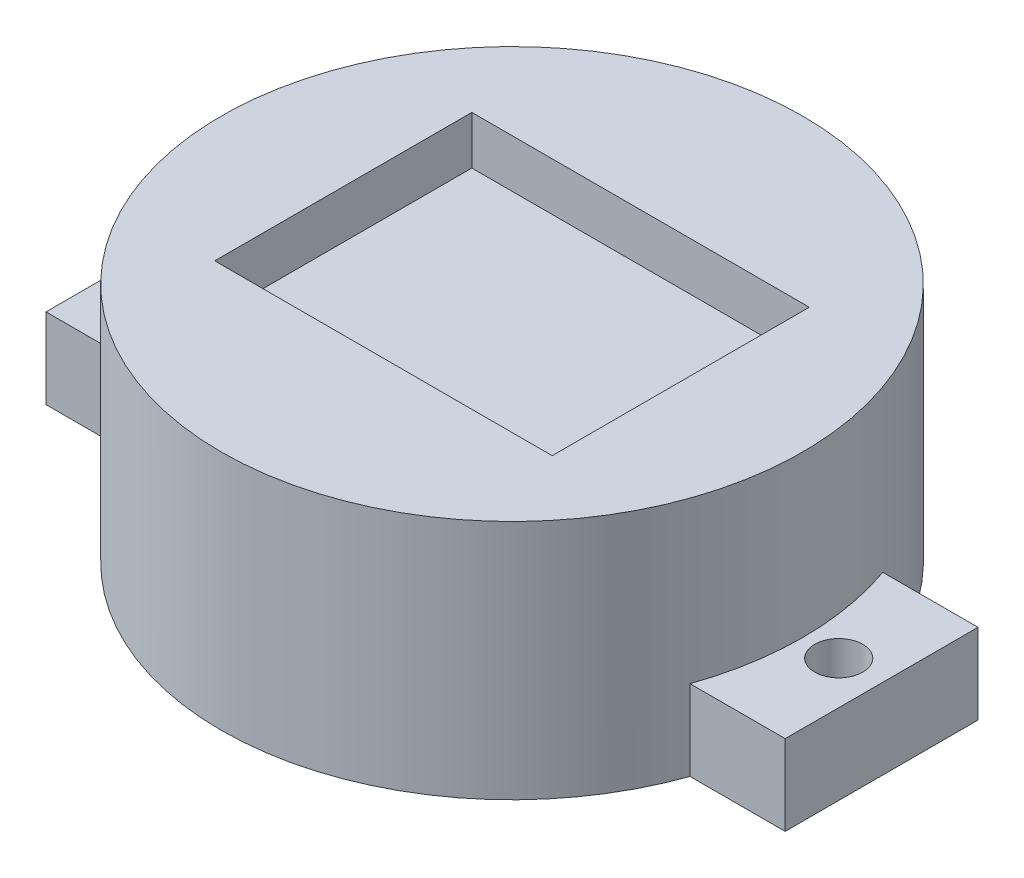
ISO-10303-21;
HEADER;
FILE_DESCRIPTION(('STEP AP214'),'2;1');
FILE_NAME('part.step','',(''),(''),'','','');
FILE_SCHEMA(('AUTOMOTIVE_DESIGN { 1 0 10303 214 1 1 1 1 }'));
ENDSEC;
DATA;
#1=APPLICATION_CONTEXT('core data for automotive mechanical design processes');
#2=APPLICATION_PROTOCOL_DEFINITION('international standard','automotive_design',2000,#1);
#3=PRODUCT_CONTEXT('',#1,'mechanical');
#4=PRODUCT('Part','Part','',(#3));
#5=PRODUCT_RELATED_PRODUCT_CATEGORY('part','',(#4));
#6=PRODUCT_DEFINITION_FORMATION('','',#4);
#7=PRODUCT_DEFINITION_CONTEXT('part definition',#1,'design');
#8=PRODUCT_DEFINITION('design','',#6,#7);
#9=PRODUCT_DEFINITION_SHAPE('','',#8);
#10=(LENGTH_UNIT() NAMED_UNIT(*) SI_UNIT(.MILLI.,.METRE.));
#11=(NAMED_UNIT(*) PLANE_ANGLE_UNIT() SI_UNIT($,.RADIAN.));
#12=(NAMED_UNIT(*) SI_UNIT($,.STERADIAN.) SOLID_ANGLE_UNIT());
#13=UNCERTAINTY_MEASURE_WITH_UNIT(LENGTH_MEASURE(1.E-05),#10,'distance_accuracy_value','');
#14=(GEOMETRIC_REPRESENTATION_CONTEXT(3) GLOBAL_UNCERTAINTY_ASSIGNED_CONTEXT((#13)) GLOBAL_UNIT_ASSIGNED_CONTEXT((#10,
#11,#12)) REPRESENTATION_CONTEXT('',''));
#15=CARTESIAN_POINT('',(0.,0.,0.));
#16=DIRECTION('',(0.,0.,1.));
#17=DIRECTION('',(1.,0.,0.));
#18=AXIS2_PLACEMENT_3D('',#15,#16,#17);
#19=CARTESIAN_POINT('',(-18.1,9.,0.));
#20=DIRECTION('',(0.,1.,0.));
#21=DIRECTION('',(0.,0.,1.));
#22=AXIS2_PLACEMENT_3D('',#19,#20,#21);
#23=PLANE('',#22);
#24=DIRECTION('',(0.,0.,-1.));
#25=VECTOR('',#24,1.);
#26=CARTESIAN_POINT('',(10.5,9.,8.));
#27=LINE('',#26,#25);
#28=CARTESIAN_POINT('',(10.5,9.,8.));
#29=VERTEX_POINT('',#28);
#30=CARTESIAN_POINT('',(10.5,9.,-8.));
#31=VERTEX_POINT('',#30);
#32=EDGE_CURVE('E183',#29,#31,#27,.T.);
#33=ORIENTED_EDGE('',*,*,#32,.F.);
#34=DIRECTION('',(1.,0.,0.));
#35=VECTOR('',#34,1.);
#36=CARTESIAN_POINT('',(-10.5,9.,8.));
#37=LINE('',#36,#35);
#38=CARTESIAN_POINT('',(-10.5,9.,8.));
#39=VERTEX_POINT('',#38);
#40=EDGE_CURVE('E190',#39,#29,#37,.T.);
#41=ORIENTED_EDGE('',*,*,#40,.F.);
#42=DIRECTION('',(0.,0.,1.));
#43=VECTOR('',#42,1.);
#44=CARTESIAN_POINT('',(-10.5,9.,8.));
#45=LINE('',#44,#43);
#46=CARTESIAN_POINT('',(-10.5,9.,-8.));
#47=VERTEX_POINT('',#46);
#48=EDGE_CURVE('E204',#47,#39,#45,.T.);
#49=ORIENTED_EDGE('',*,*,#48,.F.);
#50=DIRECTION('',(-1.,0.,0.));
#51=VECTOR('',#50,1.);
#52=CARTESIAN_POINT('',(-10.5,9.,-8.));
#53=LINE('',#52,#51);
#54=EDGE_CURVE('E201',#31,#47,#53,.T.);
#55=ORIENTED_EDGE('',*,*,#54,.F.);
#56=EDGE_LOOP('',(#33,#41,#49,#55));
#57=FACE_BOUND('',#56,.T.);
#58=CARTESIAN_POINT('',(0.,9.,0.));
#59=DIRECTION('',(0.,1.,0.));
#60=DIRECTION('',(0.,0.,1.));
#61=AXIS2_PLACEMENT_3D('',#58,#59,#60);
#62=CIRCLE('',#61,18.1);
#63=CARTESIAN_POINT('',(0.,9.,18.1));
#64=VERTEX_POINT('',#63);
#65=EDGE_CURVE('E211',#64,#64,#62,.T.);
#66=ORIENTED_EDGE('',*,*,#65,.T.);
#67=EDGE_LOOP('',(#66));
#68=FACE_BOUND('',#67,.T.);
#69=ADVANCED_FACE('F39',(#57,#68),#23,.T.);
#70=CARTESIAN_POINT('',(-13.1,0.,0.));
#71=DIRECTION('',(0.,-1.,0.));
#72=DIRECTION('',(0.,0.,-1.));
#73=AXIS2_PLACEMENT_3D('',#70,#71,#72);
#74=PLANE('',#73);
#75=CARTESIAN_POINT('',(0.,0.,0.));
#76=DIRECTION('',(0.,1.,0.));
#77=DIRECTION('',(0.,0.,1.));
#78=AXIS2_PLACEMENT_3D('',#75,#76,#77);
#79=CIRCLE('',#78,13.1);
#80=CARTESIAN_POINT('',(0.,0.,13.1));
#81=VERTEX_POINT('',#80);
#82=EDGE_CURVE('E226',#81,#81,#79,.T.);
#83=ORIENTED_EDGE('',*,*,#82,.F.);
#84=EDGE_LOOP('',(#83));
#85=FACE_BOUND('',#84,.T.);
#86=ADVANCED_FACE('F271',(#85),#74,.T.);
#87=CARTESIAN_POINT('',(0.,25.3230066385182,0.));
#88=DIRECTION('',(0.,1.,0.));
#89=DIRECTION('',(0.,0.,1.));
#90=AXIS2_PLACEMENT_3D('',#87,#88,#89);
#91=CYLINDRICAL_SURFACE('',#90,13.1);
#92=ORIENTED_EDGE('',*,*,#82,.T.);
#93=EDGE_LOOP('',(#92));
#94=FACE_BOUND('',#93,.T.);
#95=CARTESIAN_POINT('',(0.,-6.,0.));
#96=DIRECTION('',(0.,1.,0.));
#97=DIRECTION('',(0.,0.,1.));
#98=AXIS2_PLACEMENT_3D('',#95,#96,#97);
#99=CIRCLE('',#98,13.1);
#100=CARTESIAN_POINT('',(0.,-6.,13.1));
#101=VERTEX_POINT('',#100);
#102=EDGE_CURVE('E223',#101,#101,#99,.T.);
#103=ORIENTED_EDGE('',*,*,#102,.F.);
#104=EDGE_LOOP('',(#103));
#105=FACE_BOUND('',#104,.T.);
#106=ADVANCED_FACE('F276',(#94,#105),#91,.F.);
#107=CARTESIAN_POINT('',(-18.1,-6.,0.));
#108=DIRECTION('',(0.,-1.,0.));
#109=DIRECTION('',(0.,0.,-1.));
#110=AXIS2_PLACEMENT_3D('',#107,#108,#109);
#111=PLANE('',#110);
#112=DIRECTION('',(-1.,0.,0.));
#113=VECTOR('',#112,1.);
#114=CARTESIAN_POINT('',(15.,-6.,5.99999999999999));
#115=LINE('',#114,#113);
#116=CARTESIAN_POINT('',(23.,-6.,5.99999999999999));
#117=VERTEX_POINT('',#116);
#118=CARTESIAN_POINT('',(17.076592165886,-6.,5.99999999999999));
#119=VERTEX_POINT('',#118);
#120=EDGE_CURVE('E133',#117,#119,#115,.T.);
#121=ORIENTED_EDGE('',*,*,#120,.T.);
#122=CARTESIAN_POINT('',(0.,-6.,0.));
#123=DIRECTION('',(0.,1.,0.));
#124=DIRECTION('',(0.,0.,1.));
#125=AXIS2_PLACEMENT_3D('',#122,#123,#124);
#126=CIRCLE('',#125,18.1);
#127=CARTESIAN_POINT('',(-17.076592165886,-6.,5.99999999999999));
#128=VERTEX_POINT('',#127);
#129=EDGE_CURVE('E221',#128,#119,#126,.T.);
#130=ORIENTED_EDGE('',*,*,#129,.F.);
#131=DIRECTION('',(-1.,0.,0.));
#132=VECTOR('',#131,1.);
#133=CARTESIAN_POINT('',(-15.,-6.,5.99999999999999));
#134=LINE('',#133,#132);
#135=CARTESIAN_POINT('',(-23.,-6.,5.99999999999999));
#136=VERTEX_POINT('',#135);
#137=EDGE_CURVE('E162',#128,#136,#134,.T.);
#138=ORIENTED_EDGE('',*,*,#137,.T.);
#139=DIRECTION('',(0.,0.,-1.));
#140=VECTOR('',#139,1.);
#141=CARTESIAN_POINT('',(-23.,-6.,5.99999999999999));
#142=LINE('',#141,#140);
#143=CARTESIAN_POINT('',(-23.,-6.,-6.00000000000001));
#144=VERTEX_POINT('',#143);
#145=EDGE_CURVE('E176',#136,#144,#142,.T.);
#146=ORIENTED_EDGE('',*,*,#145,.T.);
#147=DIRECTION('',(1.,0.,0.));
#148=VECTOR('',#147,1.);
#149=CARTESIAN_POINT('',(-15.,-6.,-6.00000000000001));
#150=LINE('',#149,#148);
#151=CARTESIAN_POINT('',(-17.076592165886,-6.,-6.00000000000001));
#152=VERTEX_POINT('',#151);
#153=EDGE_CURVE('E168',#144,#152,#150,.T.);
#154=ORIENTED_EDGE('',*,*,#153,.T.);
#155=CARTESIAN_POINT('',(17.076592165886,-6.,-6.00000000000001));
#156=VERTEX_POINT('',#155);
#157=EDGE_CURVE('E220',#156,#152,#126,.T.);
#158=ORIENTED_EDGE('',*,*,#157,.F.);
#159=DIRECTION('',(1.,0.,0.));
#160=VECTOR('',#159,1.);
#161=CARTESIAN_POINT('',(15.,-6.,-6.00000000000001));
#162=LINE('',#161,#160);
#163=CARTESIAN_POINT('',(23.,-6.,-6.00000000000001));
#164=VERTEX_POINT('',#163);
#165=EDGE_CURVE('E151',#156,#164,#162,.T.);
#166=ORIENTED_EDGE('',*,*,#165,.T.);
#167=DIRECTION('',(0.,0.,1.));
#168=VECTOR('',#167,1.);
#169=CARTESIAN_POINT('',(23.,-6.,5.99999999999999));
#170=LINE('',#169,#168);
#171=EDGE_CURVE('E140',#164,#117,#170,.T.);
#172=ORIENTED_EDGE('',*,*,#171,.T.);
#173=EDGE_LOOP('',(#121,#130,#138,#146,#154,#158,#166,#172));
#174=FACE_BOUND('',#173,.T.);
#175=ORIENTED_EDGE('',*,*,#102,.T.);
#176=EDGE_LOOP('',(#175));
#177=FACE_BOUND('',#176,.T.);
#178=CARTESIAN_POINT('',(-20.3333333333333,-6.,0.));
#179=DIRECTION('',(0.,-1.,0.));
#180=DIRECTION('',(0.,0.,-1.));
#181=AXIS2_PLACEMENT_3D('',#178,#179,#180);
#182=CIRCLE('',#181,1.5);
#183=CARTESIAN_POINT('',(-20.3333333333333,-6.,-1.50000000000001));
#184=VERTEX_POINT('',#183);
#185=EDGE_CURVE('E157',#184,#184,#182,.T.);
#186=ORIENTED_EDGE('',*,*,#185,.F.);
#187=EDGE_LOOP('',(#186));
#188=FACE_BOUND('',#187,.T.);
#189=CARTESIAN_POINT('',(20.3333333333333,-6.,0.));
#190=DIRECTION('',(0.,-1.,0.));
#191=DIRECTION('',(0.,0.,1.));
#192=AXIS2_PLACEMENT_3D('',#189,#190,#191);
#193=CIRCLE('',#192,1.5);
#194=CARTESIAN_POINT('',(20.3333333333333,-6.,1.5));
#195=VERTEX_POINT('',#194);
#196=EDGE_CURVE('E310',#195,#195,#193,.T.);
#197=ORIENTED_EDGE('',*,*,#196,.F.);
#198=EDGE_LOOP('',(#197));
#199=FACE_BOUND('',#198,.T.);
#200=ADVANCED_FACE('F243',(#174,#177,#188,#199),#111,.T.);
#201=CARTESIAN_POINT('',(0.,25.3230066385182,0.));
#202=DIRECTION('',(0.,1.,0.));
#203=DIRECTION('',(0.,0.,1.));
#204=AXIS2_PLACEMENT_3D('',#201,#202,#203);
#205=CYLINDRICAL_SURFACE('',#204,18.1);
#206=DIRECTION('',(0.,1.,0.));
#207=VECTOR('',#206,1.);
#208=CARTESIAN_POINT('',(17.076592165886,25.3230066385182,5.99999999999999));
#209=LINE('',#208,#207);
#210=CARTESIAN_POINT('',(17.076592165886,-1.,5.99999999999999));
#211=VERTEX_POINT('',#210);
#212=EDGE_CURVE('E11',#211,#119,#209,.F.);
#213=ORIENTED_EDGE('',*,*,#212,.F.);
#214=CARTESIAN_POINT('',(0.,-1.,0.));
#215=DIRECTION('',(0.,-1.,0.));
#216=DIRECTION('',(0.,0.,-1.));
#217=AXIS2_PLACEMENT_3D('',#214,#215,#216);
#218=CIRCLE('',#217,18.1);
#219=CARTESIAN_POINT('',(17.076592165886,-1.,-6.00000000000001));
#220=VERTEX_POINT('',#219);
#221=EDGE_CURVE('E53',#211,#220,#218,.F.);
#222=ORIENTED_EDGE('',*,*,#221,.T.);
#223=DIRECTION('',(0.,1.,0.));
#224=VECTOR('',#223,1.);
#225=CARTESIAN_POINT('',(17.076592165886,25.3230066385182,-6.00000000000001));
#226=LINE('',#225,#224);
#227=EDGE_CURVE('E46',#156,#220,#226,.T.);
#228=ORIENTED_EDGE('',*,*,#227,.F.);
#229=ORIENTED_EDGE('',*,*,#157,.T.);
#230=DIRECTION('',(0.,1.,0.));
#231=VECTOR('',#230,1.);
#232=CARTESIAN_POINT('',(-17.076592165886,25.3230066385182,-6.00000000000001));
#233=LINE('',#232,#231);
#234=CARTESIAN_POINT('',(-17.076592165886,-1.,-6.00000000000001));
#235=VERTEX_POINT('',#234);
#236=EDGE_CURVE('E235',#235,#152,#233,.F.);
#237=ORIENTED_EDGE('',*,*,#236,.F.);
#238=CARTESIAN_POINT('',(0.,-1.,0.));
#239=DIRECTION('',(0.,1.,0.));
#240=DIRECTION('',(0.,0.,1.));
#241=AXIS2_PLACEMENT_3D('',#238,#239,#240);
#242=CIRCLE('',#241,18.1);
#243=CARTESIAN_POINT('',(-17.076592165886,-1.,5.99999999999999));
#244=VERTEX_POINT('',#243);
#245=EDGE_CURVE('E229',#244,#235,#242,.F.);
#246=ORIENTED_EDGE('',*,*,#245,.F.);
#247=DIRECTION('',(0.,1.,0.));
#248=VECTOR('',#247,1.);
#249=CARTESIAN_POINT('',(-17.076592165886,25.3230066385182,5.99999999999999));
#250=LINE('',#249,#248);
#251=EDGE_CURVE('E232',#128,#244,#250,.T.);
#252=ORIENTED_EDGE('',*,*,#251,.F.);
#253=ORIENTED_EDGE('',*,*,#129,.T.);
#254=EDGE_LOOP('',(#213,#222,#228,#229,#237,#246,#252,#253));
#255=FACE_BOUND('',#254,.T.);
#256=ORIENTED_EDGE('',*,*,#65,.F.);
#257=EDGE_LOOP('',(#256));
#258=FACE_BOUND('',#257,.T.);
#259=ADVANCED_FACE('F255',(#255,#258),#205,.T.);
#260=CARTESIAN_POINT('',(10.5,6.,8.));
#261=DIRECTION('',(1.,0.,0.));
#262=DIRECTION('',(0.,0.,-1.));
#263=AXIS2_PLACEMENT_3D('',#260,#261,#262);
#264=PLANE('',#263);
#265=ORIENTED_EDGE('',*,*,#32,.T.);
#266=DIRECTION('',(0.,1.,0.));
#267=VECTOR('',#266,1.);
#268=CARTESIAN_POINT('',(10.5,6.,-8.));
#269=LINE('',#268,#267);
#270=CARTESIAN_POINT('',(10.5,6.,-8.));
#271=VERTEX_POINT('',#270);
#272=EDGE_CURVE('E199',#271,#31,#269,.T.);
#273=ORIENTED_EDGE('',*,*,#272,.F.);
#274=DIRECTION('',(0.,0.,-1.));
#275=VECTOR('',#274,1.);
#276=CARTESIAN_POINT('',(10.5,6.,8.));
#277=LINE('',#276,#275);
#278=CARTESIAN_POINT('',(10.5,6.,8.));
#279=VERTEX_POINT('',#278);
#280=EDGE_CURVE('E186',#279,#271,#277,.T.);
#281=ORIENTED_EDGE('',*,*,#280,.F.);
#282=DIRECTION('',(0.,1.,0.));
#283=VECTOR('',#282,1.);
#284=CARTESIAN_POINT('',(10.5,6.,8.));
#285=LINE('',#284,#283);
#286=EDGE_CURVE('E209',#279,#29,#285,.T.);
#287=ORIENTED_EDGE('',*,*,#286,.T.);
#288=EDGE_LOOP('',(#265,#273,#281,#287));
#289=FACE_BOUND('',#288,.T.);
#290=ADVANCED_FACE('F284',(#289),#264,.F.);
#291=CARTESIAN_POINT('',(-10.5,6.,8.));
#292=DIRECTION('',(0.,0.,1.));
#293=DIRECTION('',(1.,0.,0.));
#294=AXIS2_PLACEMENT_3D('',#291,#292,#293);
#295=PLANE('',#294);
#296=ORIENTED_EDGE('',*,*,#40,.T.);
#297=ORIENTED_EDGE('',*,*,#286,.F.);
#298=DIRECTION('',(1.,0.,0.));
#299=VECTOR('',#298,1.);
#300=CARTESIAN_POINT('',(-10.5,6.,8.));
#301=LINE('',#300,#299);
#302=CARTESIAN_POINT('',(-10.5,6.,8.));
#303=VERTEX_POINT('',#302);
#304=EDGE_CURVE('E196',#303,#279,#301,.T.);
#305=ORIENTED_EDGE('',*,*,#304,.F.);
#306=DIRECTION('',(0.,1.,0.));
#307=VECTOR('',#306,1.);
#308=CARTESIAN_POINT('',(-10.5,6.,8.));
#309=LINE('',#308,#307);
#310=EDGE_CURVE('E212',#303,#39,#309,.T.);
#311=ORIENTED_EDGE('',*,*,#310,.T.);
#312=EDGE_LOOP('',(#296,#297,#305,#311));
#313=FACE_BOUND('',#312,.T.);
#314=ADVANCED_FACE('F291',(#313),#295,.F.);
#315=CARTESIAN_POINT('',(-10.5,6.,8.));
#316=DIRECTION('',(-1.,0.,0.));
#317=DIRECTION('',(0.,0.,1.));
#318=AXIS2_PLACEMENT_3D('',#315,#316,#317);
#319=PLANE('',#318);
#320=ORIENTED_EDGE('',*,*,#48,.T.);
#321=ORIENTED_EDGE('',*,*,#310,.F.);
#322=DIRECTION('',(0.,0.,1.));
#323=VECTOR('',#322,1.);
#324=CARTESIAN_POINT('',(-10.5,6.,8.));
#325=LINE('',#324,#323);
#326=CARTESIAN_POINT('',(-10.5,6.,-8.));
#327=VERTEX_POINT('',#326);
#328=EDGE_CURVE('E193',#327,#303,#325,.T.);
#329=ORIENTED_EDGE('',*,*,#328,.F.);
#330=DIRECTION('',(0.,1.,0.));
#331=VECTOR('',#330,1.);
#332=CARTESIAN_POINT('',(-10.5,6.,-8.));
#333=LINE('',#332,#331);
#334=EDGE_CURVE('E214',#327,#47,#333,.T.);
#335=ORIENTED_EDGE('',*,*,#334,.T.);
#336=EDGE_LOOP('',(#320,#321,#329,#335));
#337=FACE_BOUND('',#336,.T.);
#338=ADVANCED_FACE('F344',(#337),#319,.F.);
#339=CARTESIAN_POINT('',(-10.5,6.,-8.));
#340=DIRECTION('',(0.,0.,-1.));
#341=DIRECTION('',(-1.,0.,0.));
#342=AXIS2_PLACEMENT_3D('',#339,#340,#341);
#343=PLANE('',#342);
#344=ORIENTED_EDGE('',*,*,#54,.T.);
#345=ORIENTED_EDGE('',*,*,#334,.F.);
#346=DIRECTION('',(-1.,0.,0.));
#347=VECTOR('',#346,1.);
#348=CARTESIAN_POINT('',(-10.5,6.,-8.));
#349=LINE('',#348,#347);
#350=EDGE_CURVE('E189',#271,#327,#349,.T.);
#351=ORIENTED_EDGE('',*,*,#350,.F.);
#352=ORIENTED_EDGE('',*,*,#272,.T.);
#353=EDGE_LOOP('',(#344,#345,#351,#352));
#354=FACE_BOUND('',#353,.T.);
#355=ADVANCED_FACE('F339',(#354),#343,.F.);
#356=CARTESIAN_POINT('',(0.,6.,0.));
#357=DIRECTION('',(0.,-1.,0.));
#358=DIRECTION('',(0.,0.,-1.));
#359=AXIS2_PLACEMENT_3D('',#356,#357,#358);
#360=PLANE('',#359);
#361=ORIENTED_EDGE('',*,*,#280,.T.);
#362=ORIENTED_EDGE('',*,*,#350,.T.);
#363=ORIENTED_EDGE('',*,*,#328,.T.);
#364=ORIENTED_EDGE('',*,*,#304,.T.);
#365=EDGE_LOOP('',(#361,#362,#363,#364));
#366=FACE_BOUND('',#365,.T.);
#367=ADVANCED_FACE('F336',(#366),#360,.F.);
#368=CARTESIAN_POINT('',(-15.,-1.,-6.00000000000001));
#369=DIRECTION('',(0.,0.,-1.));
#370=DIRECTION('',(-1.,0.,0.));
#371=AXIS2_PLACEMENT_3D('',#368,#369,#370);
#372=PLANE('',#371);
#373=DIRECTION('',(1.,0.,0.));
#374=VECTOR('',#373,1.);
#375=CARTESIAN_POINT('',(-15.,-1.,-6.00000000000001));
#376=LINE('',#375,#374);
#377=CARTESIAN_POINT('',(-23.,-1.,-6.00000000000001));
#378=VERTEX_POINT('',#377);
#379=EDGE_CURVE('E171',#378,#235,#376,.T.);
#380=ORIENTED_EDGE('',*,*,#379,.T.);
#381=ORIENTED_EDGE('',*,*,#236,.T.);
#382=ORIENTED_EDGE('',*,*,#153,.F.);
#383=DIRECTION('',(0.,-1.,0.));
#384=VECTOR('',#383,1.);
#385=CARTESIAN_POINT('',(-23.,-1.,-6.00000000000001));
#386=LINE('',#385,#384);
#387=EDGE_CURVE('E181',#378,#144,#386,.T.);
#388=ORIENTED_EDGE('',*,*,#387,.F.);
#389=EDGE_LOOP('',(#380,#381,#382,#388));
#390=FACE_BOUND('',#389,.T.);
#391=ADVANCED_FACE('F240',(#390),#372,.T.);
#392=CARTESIAN_POINT('',(-23.,-1.,5.99999999999999));
#393=DIRECTION('',(-1.,0.,0.));
#394=DIRECTION('',(0.,0.,1.));
#395=AXIS2_PLACEMENT_3D('',#392,#393,#394);
#396=PLANE('',#395);
#397=ORIENTED_EDGE('',*,*,#145,.F.);
#398=DIRECTION('',(0.,-1.,0.));
#399=VECTOR('',#398,1.);
#400=CARTESIAN_POINT('',(-23.,-1.,5.99999999999999));
#401=LINE('',#400,#399);
#402=CARTESIAN_POINT('',(-23.,-1.,5.99999999999999));
#403=VERTEX_POINT('',#402);
#404=EDGE_CURVE('E174',#403,#136,#401,.T.);
#405=ORIENTED_EDGE('',*,*,#404,.F.);
#406=DIRECTION('',(0.,0.,-1.));
#407=VECTOR('',#406,1.);
#408=CARTESIAN_POINT('',(-23.,-1.,5.99999999999999));
#409=LINE('',#408,#407);
#410=EDGE_CURVE('E167',#403,#378,#409,.T.);
#411=ORIENTED_EDGE('',*,*,#410,.T.);
#412=ORIENTED_EDGE('',*,*,#387,.T.);
#413=EDGE_LOOP('',(#397,#405,#411,#412));
#414=FACE_BOUND('',#413,.T.);
#415=ADVANCED_FACE('F249',(#414),#396,.T.);
#416=CARTESIAN_POINT('',(-15.,-1.,5.99999999999999));
#417=DIRECTION('',(0.,0.,1.));
#418=DIRECTION('',(1.,0.,0.));
#419=AXIS2_PLACEMENT_3D('',#416,#417,#418);
#420=PLANE('',#419);
#421=ORIENTED_EDGE('',*,*,#137,.F.);
#422=ORIENTED_EDGE('',*,*,#251,.T.);
#423=DIRECTION('',(-1.,0.,0.));
#424=VECTOR('',#423,1.);
#425=CARTESIAN_POINT('',(-15.,-1.,5.99999999999999));
#426=LINE('',#425,#424);
#427=EDGE_CURVE('E165',#244,#403,#426,.T.);
#428=ORIENTED_EDGE('',*,*,#427,.T.);
#429=ORIENTED_EDGE('',*,*,#404,.T.);
#430=EDGE_LOOP('',(#421,#422,#428,#429));
#431=FACE_BOUND('',#430,.T.);
#432=ADVANCED_FACE('F258',(#431),#420,.T.);
#433=CARTESIAN_POINT('',(0.,-1.,0.));
#434=DIRECTION('',(0.,1.,0.));
#435=DIRECTION('',(0.,0.,1.));
#436=AXIS2_PLACEMENT_3D('',#433,#434,#435);
#437=PLANE('',#436);
#438=CARTESIAN_POINT('',(-20.3333333333333,-1.,0.));
#439=DIRECTION('',(0.,-1.,0.));
#440=DIRECTION('',(0.,0.,-1.));
#441=AXIS2_PLACEMENT_3D('',#438,#439,#440);
#442=CIRCLE('',#441,1.5);
#443=CARTESIAN_POINT('',(-20.3333333333333,-1.,-1.50000000000001));
#444=VERTEX_POINT('',#443);
#445=EDGE_CURVE('E159',#444,#444,#442,.T.);
#446=ORIENTED_EDGE('',*,*,#445,.T.);
#447=EDGE_LOOP('',(#446));
#448=FACE_BOUND('',#447,.T.);
#449=ORIENTED_EDGE('',*,*,#427,.F.);
#450=ORIENTED_EDGE('',*,*,#245,.T.);
#451=ORIENTED_EDGE('',*,*,#379,.F.);
#452=ORIENTED_EDGE('',*,*,#410,.F.);
#453=EDGE_LOOP('',(#449,#450,#451,#452));
#454=FACE_BOUND('',#453,.T.);
#455=ADVANCED_FACE('F253',(#448,#454),#437,.T.);
#456=CARTESIAN_POINT('',(-20.3333333333333,-1.,0.));
#457=DIRECTION('',(0.,-1.,0.));
#458=DIRECTION('',(0.,0.,-1.));
#459=AXIS2_PLACEMENT_3D('',#456,#457,#458);
#460=CYLINDRICAL_SURFACE('',#459,1.5);
#461=ORIENTED_EDGE('',*,*,#445,.F.);
#462=EDGE_LOOP('',(#461));
#463=FACE_BOUND('',#462,.T.);
#464=ORIENTED_EDGE('',*,*,#185,.T.);
#465=EDGE_LOOP('',(#464));
#466=FACE_BOUND('',#465,.T.);
#467=ADVANCED_FACE('F265',(#463,#466),#460,.F.);
#468=CARTESIAN_POINT('',(15.,-1.,5.99999999999999));
#469=DIRECTION('',(0.,0.,1.));
#470=DIRECTION('',(1.,0.,0.));
#471=AXIS2_PLACEMENT_3D('',#468,#469,#470);
#472=PLANE('',#471);
#473=DIRECTION('',(-1.,0.,0.));
#474=VECTOR('',#473,1.);
#475=CARTESIAN_POINT('',(15.,-1.,5.99999999999999));
#476=LINE('',#475,#474);
#477=CARTESIAN_POINT('',(23.,-1.,5.99999999999999));
#478=VERTEX_POINT('',#477);
#479=EDGE_CURVE('E142',#478,#211,#476,.T.);
#480=ORIENTED_EDGE('',*,*,#479,.T.);
#481=ORIENTED_EDGE('',*,*,#212,.T.);
#482=ORIENTED_EDGE('',*,*,#120,.F.);
#483=DIRECTION('',(0.,-1.,0.));
#484=VECTOR('',#483,1.);
#485=CARTESIAN_POINT('',(23.,-1.,5.99999999999999));
#486=LINE('',#485,#484);
#487=EDGE_CURVE('E141',#478,#117,#486,.T.);
#488=ORIENTED_EDGE('',*,*,#487,.F.);
#489=EDGE_LOOP('',(#480,#481,#482,#488));
#490=FACE_BOUND('',#489,.T.);
#491=ADVANCED_FACE('F324',(#490),#472,.T.);
#492=CARTESIAN_POINT('',(23.,-1.,5.99999999999999));
#493=DIRECTION('',(1.,0.,0.));
#494=DIRECTION('',(0.,0.,-1.));
#495=AXIS2_PLACEMENT_3D('',#492,#493,#494);
#496=PLANE('',#495);
#497=ORIENTED_EDGE('',*,*,#171,.F.);
#498=DIRECTION('',(0.,-1.,0.));
#499=VECTOR('',#498,1.);
#500=CARTESIAN_POINT('',(23.,-1.,-6.00000000000001));
#501=LINE('',#500,#499);
#502=CARTESIAN_POINT('',(23.,-1.,-6.00000000000001));
#503=VERTEX_POINT('',#502);
#504=EDGE_CURVE('E128',#503,#164,#501,.T.);
#505=ORIENTED_EDGE('',*,*,#504,.F.);
#506=DIRECTION('',(0.,0.,1.));
#507=VECTOR('',#506,1.);
#508=CARTESIAN_POINT('',(23.,-1.,5.99999999999999));
#509=LINE('',#508,#507);
#510=EDGE_CURVE('E132',#503,#478,#509,.T.);
#511=ORIENTED_EDGE('',*,*,#510,.T.);
#512=ORIENTED_EDGE('',*,*,#487,.T.);
#513=EDGE_LOOP('',(#497,#505,#511,#512));
#514=FACE_BOUND('',#513,.T.);
#515=ADVANCED_FACE('F137',(#514),#496,.T.);
#516=CARTESIAN_POINT('',(15.,-1.,-6.00000000000001));
#517=DIRECTION('',(0.,0.,-1.));
#518=DIRECTION('',(-1.,0.,0.));
#519=AXIS2_PLACEMENT_3D('',#516,#517,#518);
#520=PLANE('',#519);
#521=ORIENTED_EDGE('',*,*,#165,.F.);
#522=ORIENTED_EDGE('',*,*,#227,.T.);
#523=DIRECTION('',(1.,0.,0.));
#524=VECTOR('',#523,1.);
#525=CARTESIAN_POINT('',(15.,-1.,-6.00000000000001));
#526=LINE('',#525,#524);
#527=EDGE_CURVE('E124',#220,#503,#526,.T.);
#528=ORIENTED_EDGE('',*,*,#527,.T.);
#529=ORIENTED_EDGE('',*,*,#504,.T.);
#530=EDGE_LOOP('',(#521,#522,#528,#529));
#531=FACE_BOUND('',#530,.T.);
#532=ADVANCED_FACE('F127',(#531),#520,.T.);
#533=CARTESIAN_POINT('',(0.,-1.,0.));
#534=DIRECTION('',(0.,-1.,0.));
#535=DIRECTION('',(0.,0.,-1.));
#536=AXIS2_PLACEMENT_3D('',#533,#534,#535);
#537=PLANE('',#536);
#538=ORIENTED_EDGE('',*,*,#221,.F.);
#539=ORIENTED_EDGE('',*,*,#479,.F.);
#540=ORIENTED_EDGE('',*,*,#510,.F.);
#541=ORIENTED_EDGE('',*,*,#527,.F.);
#542=EDGE_LOOP('',(#538,#539,#540,#541));
#543=FACE_BOUND('',#542,.T.);
#544=CARTESIAN_POINT('',(20.3333333333333,-1.,0.));
#545=DIRECTION('',(0.,-1.,0.));
#546=DIRECTION('',(0.,0.,1.));
#547=AXIS2_PLACEMENT_3D('',#544,#545,#546);
#548=CIRCLE('',#547,1.5);
#549=CARTESIAN_POINT('',(20.3333333333333,-1.,1.5));
#550=VERTEX_POINT('',#549);
#551=EDGE_CURVE('E153',#550,#550,#548,.T.);
#552=ORIENTED_EDGE('',*,*,#551,.T.);
#553=EDGE_LOOP('',(#552));
#554=FACE_BOUND('',#553,.T.);
#555=ADVANCED_FACE('F144',(#543,#554),#537,.F.);
#556=CARTESIAN_POINT('',(20.3333333333333,-1.,0.));
#557=DIRECTION('',(0.,-1.,0.));
#558=DIRECTION('',(0.,0.,-1.));
#559=AXIS2_PLACEMENT_3D('',#556,#557,#558);
#560=CYLINDRICAL_SURFACE('',#559,1.5);
#561=ORIENTED_EDGE('',*,*,#551,.F.);
#562=EDGE_LOOP('',(#561));
#563=FACE_BOUND('',#562,.T.);
#564=ORIENTED_EDGE('',*,*,#196,.T.);
#565=EDGE_LOOP('',(#564));
#566=FACE_BOUND('',#565,.T.);
#567=ADVANCED_FACE('F316',(#563,#566),#560,.F.);
#568=CLOSED_SHELL('',(#69,#86,#106,#200,#259,#290,#314,#338,#355,#367,#391,#415,#432,#455,#467,
#491,#515,#532,#555,#567));
#569=MANIFOLD_SOLID_BREP('B2',#568);
#570=ADVANCED_BREP_SHAPE_REPRESENTATION('',(#18,#569),#14);
#571=SHAPE_DEFINITION_REPRESENTATION(#9,#570);
ENDSEC;
END-ISO-10303-21;
